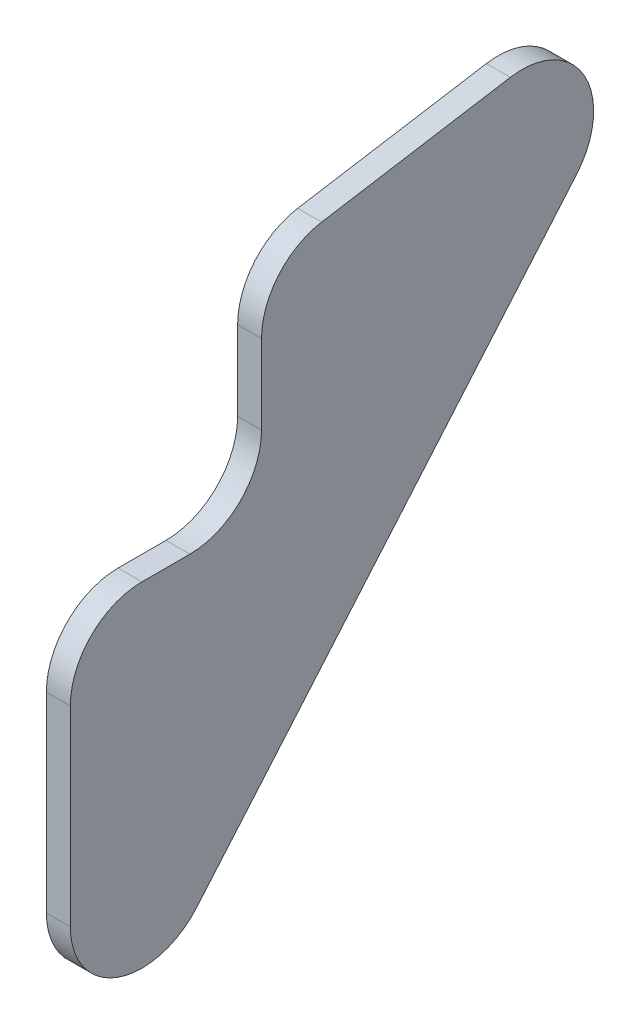
ISO-10303-21;
HEADER;
FILE_DESCRIPTION(('STEP AP214'),'2;1');
FILE_NAME('part.step','',(''),(''),'','','');
FILE_SCHEMA(('AUTOMOTIVE_DESIGN { 1 0 10303 214 1 1 1 1 }'));
ENDSEC;
DATA;
#1=APPLICATION_CONTEXT('core data for automotive mechanical design processes');
#2=APPLICATION_PROTOCOL_DEFINITION('international standard','automotive_design',2000,#1);
#3=PRODUCT_CONTEXT('',#1,'mechanical');
#4=PRODUCT('Part','Part','',(#3));
#5=PRODUCT_RELATED_PRODUCT_CATEGORY('part','',(#4));
#6=PRODUCT_DEFINITION_FORMATION('','',#4);
#7=PRODUCT_DEFINITION_CONTEXT('part definition',#1,'design');
#8=PRODUCT_DEFINITION('design','',#6,#7);
#9=PRODUCT_DEFINITION_SHAPE('','',#8);
#10=(LENGTH_UNIT() NAMED_UNIT(*) SI_UNIT(.MILLI.,.METRE.));
#11=(NAMED_UNIT(*) PLANE_ANGLE_UNIT() SI_UNIT($,.RADIAN.));
#12=(NAMED_UNIT(*) SI_UNIT($,.STERADIAN.) SOLID_ANGLE_UNIT());
#13=UNCERTAINTY_MEASURE_WITH_UNIT(LENGTH_MEASURE(1.E-05),#10,'distance_accuracy_value','');
#14=(GEOMETRIC_REPRESENTATION_CONTEXT(3) GLOBAL_UNCERTAINTY_ASSIGNED_CONTEXT((#13)) GLOBAL_UNIT_ASSIGNED_CONTEXT((#10,
#11,#12)) REPRESENTATION_CONTEXT('',''));
#15=CARTESIAN_POINT('',(0.,0.,0.));
#16=DIRECTION('',(0.,0.,1.));
#17=DIRECTION('',(1.,0.,0.));
#18=AXIS2_PLACEMENT_3D('',#15,#16,#17);
#19=CARTESIAN_POINT('',(66.4210624839999,259.204574554,1328.475334154));
#20=DIRECTION('',(1.,0.,0.));
#21=DIRECTION('',(0.,0.,-1.));
#22=AXIS2_PLACEMENT_3D('',#19,#20,#21);
#23=CYLINDRICAL_SURFACE('',#22,9.52499999999995);
#24=CARTESIAN_POINT('',(69.5960624839999,259.204574554,1328.475334154));
#25=DIRECTION('',(1.,0.,0.));
#26=DIRECTION('',(0.,0.,-1.));
#27=AXIS2_PLACEMENT_3D('',#24,#25,#26);
#28=CIRCLE('',#27,9.52499999999995);
#29=CARTESIAN_POINT('',(69.5960624839999,259.204574554,1338.000334154));
#30=VERTEX_POINT('',#29);
#31=CARTESIAN_POINT('',(69.5960624839999,253.019073049506,1321.23204787373));
#32=VERTEX_POINT('',#31);
#33=EDGE_CURVE('E161',#30,#32,#28,.T.);
#34=ORIENTED_EDGE('',*,*,#33,.F.);
#35=DIRECTION('',(1.,0.,0.));
#36=VECTOR('',#35,1.);
#37=CARTESIAN_POINT('',(66.4210624839999,259.204574554,1338.000334154));
#38=LINE('',#37,#36);
#39=CARTESIAN_POINT('',(66.4210624839999,259.204574554,1338.000334154));
#40=VERTEX_POINT('',#39);
#41=EDGE_CURVE('E138',#40,#30,#38,.T.);
#42=ORIENTED_EDGE('',*,*,#41,.F.);
#43=CARTESIAN_POINT('',(66.4210624839999,259.204574554,1328.475334154));
#44=DIRECTION('',(1.,0.,0.));
#45=DIRECTION('',(0.,0.,-1.));
#46=AXIS2_PLACEMENT_3D('',#43,#44,#45);
#47=CIRCLE('',#46,9.52499999999995);
#48=CARTESIAN_POINT('',(66.4210624839999,253.019073049506,1321.23204787373));
#49=VERTEX_POINT('',#48);
#50=EDGE_CURVE('E132',#40,#49,#47,.T.);
#51=ORIENTED_EDGE('',*,*,#50,.T.);
#52=DIRECTION('',(1.,0.,0.));
#53=VECTOR('',#52,1.);
#54=CARTESIAN_POINT('',(66.4210624839999,253.019073049506,1321.23204787373));
#55=LINE('',#54,#53);
#56=EDGE_CURVE('E114',#49,#32,#55,.T.);
#57=ORIENTED_EDGE('',*,*,#56,.T.);
#58=EDGE_LOOP('',(#34,#42,#51,#57));
#59=FACE_BOUND('',#58,.T.);
#60=ADVANCED_FACE('F39',(#59),#23,.T.);
#61=CARTESIAN_POINT('',(66.4210624839999,259.204574554,1338.000334154));
#62=DIRECTION('',(0.,0.,1.));
#63=DIRECTION('',(1.,0.,0.));
#64=AXIS2_PLACEMENT_3D('',#61,#62,#63);
#65=PLANE('',#64);
#66=DIRECTION('',(0.,-1.,0.));
#67=VECTOR('',#66,1.);
#68=CARTESIAN_POINT('',(69.5960624839999,259.204574554,1338.000334154));
#69=LINE('',#68,#67);
#70=CARTESIAN_POINT('',(69.5960624839999,284.604574554,1338.000334154));
#71=VERTEX_POINT('',#70);
#72=EDGE_CURVE('E139',#71,#30,#69,.T.);
#73=ORIENTED_EDGE('',*,*,#72,.F.);
#74=DIRECTION('',(1.,0.,0.));
#75=VECTOR('',#74,1.);
#76=CARTESIAN_POINT('',(66.4210624839999,284.604574554,1338.000334154));
#77=LINE('',#76,#75);
#78=CARTESIAN_POINT('',(66.4210624839999,284.604574554,1338.000334154));
#79=VERTEX_POINT('',#78);
#80=EDGE_CURVE('E181',#79,#71,#77,.T.);
#81=ORIENTED_EDGE('',*,*,#80,.F.);
#82=DIRECTION('',(0.,-1.,0.));
#83=VECTOR('',#82,1.);
#84=CARTESIAN_POINT('',(66.4210624839999,259.204574554,1338.000334154));
#85=LINE('',#84,#83);
#86=EDGE_CURVE('E125',#79,#40,#85,.T.);
#87=ORIENTED_EDGE('',*,*,#86,.T.);
#88=ORIENTED_EDGE('',*,*,#41,.T.);
#89=EDGE_LOOP('',(#73,#81,#87,#88));
#90=FACE_BOUND('',#89,.T.);
#91=ADVANCED_FACE('F215',(#90),#65,.T.);
#92=CARTESIAN_POINT('',(66.4210624839999,284.604574554,1328.475334154));
#93=DIRECTION('',(1.,0.,0.));
#94=DIRECTION('',(0.,0.,-1.));
#95=AXIS2_PLACEMENT_3D('',#92,#93,#94);
#96=CYLINDRICAL_SURFACE('',#95,9.52500000000001);
#97=CARTESIAN_POINT('',(69.5960624839999,284.604574554,1328.475334154));
#98=DIRECTION('',(1.,0.,0.));
#99=DIRECTION('',(0.,0.,-1.));
#100=AXIS2_PLACEMENT_3D('',#97,#98,#99);
#101=CIRCLE('',#100,9.52500000000001);
#102=CARTESIAN_POINT('',(69.5960624839999,294.129574554,1328.475334154));
#103=VERTEX_POINT('',#102);
#104=EDGE_CURVE('E142',#103,#71,#101,.T.);
#105=ORIENTED_EDGE('',*,*,#104,.F.);
#106=DIRECTION('',(1.,0.,0.));
#107=VECTOR('',#106,1.);
#108=CARTESIAN_POINT('',(66.4210624839999,294.129574554,1328.475334154));
#109=LINE('',#108,#107);
#110=CARTESIAN_POINT('',(66.4210624839999,294.129574554,1328.475334154));
#111=VERTEX_POINT('',#110);
#112=EDGE_CURVE('E183',#111,#103,#109,.T.);
#113=ORIENTED_EDGE('',*,*,#112,.F.);
#114=CARTESIAN_POINT('',(66.4210624839999,284.604574554,1328.475334154));
#115=DIRECTION('',(1.,0.,0.));
#116=DIRECTION('',(0.,0.,-1.));
#117=AXIS2_PLACEMENT_3D('',#114,#115,#116);
#118=CIRCLE('',#117,9.52500000000001);
#119=EDGE_CURVE('E157',#111,#79,#118,.T.);
#120=ORIENTED_EDGE('',*,*,#119,.T.);
#121=ORIENTED_EDGE('',*,*,#80,.T.);
#122=EDGE_LOOP('',(#105,#113,#120,#121));
#123=FACE_BOUND('',#122,.T.);
#124=ADVANCED_FACE('F219',(#123),#96,.T.);
#125=CARTESIAN_POINT('',(66.4210624839999,294.129574554,1312.600334154));
#126=DIRECTION('',(0.,1.,0.));
#127=DIRECTION('',(0.,0.,1.));
#128=AXIS2_PLACEMENT_3D('',#125,#126,#127);
#129=PLANE('',#128);
#130=DIRECTION('',(0.,0.,1.));
#131=VECTOR('',#130,1.);
#132=CARTESIAN_POINT('',(69.5960624839999,294.129574554,1312.600334154));
#133=LINE('',#132,#131);
#134=CARTESIAN_POINT('',(69.5960624839999,294.129574554,1322.125334154));
#135=VERTEX_POINT('',#134);
#136=EDGE_CURVE('E175',#135,#103,#133,.T.);
#137=ORIENTED_EDGE('',*,*,#136,.F.);
#138=DIRECTION('',(1.,0.,0.));
#139=VECTOR('',#138,1.);
#140=CARTESIAN_POINT('',(66.4210624839999,294.129574554,1322.125334154));
#141=LINE('',#140,#139);
#142=CARTESIAN_POINT('',(66.4210624839999,294.129574554,1322.125334154));
#143=VERTEX_POINT('',#142);
#144=EDGE_CURVE('E54',#135,#143,#141,.F.);
#145=ORIENTED_EDGE('',*,*,#144,.T.);
#146=DIRECTION('',(0.,0.,1.));
#147=VECTOR('',#146,1.);
#148=CARTESIAN_POINT('',(66.4210624839999,294.129574554,1312.600334154));
#149=LINE('',#148,#147);
#150=EDGE_CURVE('E155',#143,#111,#149,.T.);
#151=ORIENTED_EDGE('',*,*,#150,.T.);
#152=ORIENTED_EDGE('',*,*,#112,.T.);
#153=EDGE_LOOP('',(#137,#145,#151,#152));
#154=FACE_BOUND('',#153,.T.);
#155=ADVANCED_FACE('F237',(#154),#129,.T.);
#156=CARTESIAN_POINT('',(66.4210624839999,314.179001214867,1312.600334154));
#157=DIRECTION('',(0.,0.,1.));
#158=DIRECTION('',(1.,0.,0.));
#159=AXIS2_PLACEMENT_3D('',#156,#157,#158);
#160=PLANE('',#159);
#161=DIRECTION('',(0.,-1.,0.));
#162=VECTOR('',#161,1.);
#163=CARTESIAN_POINT('',(66.4210624839999,314.179001214867,1312.600334154));
#164=LINE('',#163,#162);
#165=CARTESIAN_POINT('',(66.4210624839999,314.179001214867,1312.600334154));
#166=VERTEX_POINT('',#165);
#167=CARTESIAN_POINT('',(66.4210624839999,303.654574554,1312.600334154));
#168=VERTEX_POINT('',#167);
#169=EDGE_CURVE('E152',#166,#168,#164,.T.);
#170=ORIENTED_EDGE('',*,*,#169,.T.);
#171=DIRECTION('',(1.,0.,0.));
#172=VECTOR('',#171,1.);
#173=CARTESIAN_POINT('',(69.5960624839999,303.654574554,1312.600334154));
#174=LINE('',#173,#172);
#175=CARTESIAN_POINT('',(69.5960624839999,303.654574554,1312.600334154));
#176=VERTEX_POINT('',#175);
#177=EDGE_CURVE('E180',#168,#176,#174,.T.);
#178=ORIENTED_EDGE('',*,*,#177,.T.);
#179=DIRECTION('',(0.,-1.,0.));
#180=VECTOR('',#179,1.);
#181=CARTESIAN_POINT('',(69.5960624839999,314.179001214867,1312.600334154));
#182=LINE('',#181,#180);
#183=CARTESIAN_POINT('',(69.5960624839999,314.179001214867,1312.600334154));
#184=VERTEX_POINT('',#183);
#185=EDGE_CURVE('E173',#184,#176,#182,.T.);
#186=ORIENTED_EDGE('',*,*,#185,.F.);
#187=DIRECTION('',(1.,0.,0.));
#188=VECTOR('',#187,1.);
#189=CARTESIAN_POINT('',(66.4210624839999,314.179001214867,1312.600334154));
#190=LINE('',#189,#188);
#191=EDGE_CURVE('E186',#166,#184,#190,.T.);
#192=ORIENTED_EDGE('',*,*,#191,.F.);
#193=EDGE_LOOP('',(#170,#178,#186,#192));
#194=FACE_BOUND('',#193,.T.);
#195=ADVANCED_FACE('F198',(#194),#160,.T.);
#196=CARTESIAN_POINT('',(66.4210624839999,314.179001214867,1303.075334154));
#197=DIRECTION('',(1.,0.,0.));
#198=DIRECTION('',(0.,0.,-1.));
#199=AXIS2_PLACEMENT_3D('',#196,#197,#198);
#200=CYLINDRICAL_SURFACE('',#199,9.52500000000004);
#201=CARTESIAN_POINT('',(69.5960624839999,314.179001214867,1303.075334154));
#202=DIRECTION('',(1.,0.,0.));
#203=DIRECTION('',(0.,0.,-1.));
#204=AXIS2_PLACEMENT_3D('',#201,#202,#203);
#205=CIRCLE('',#204,9.52500000000004);
#206=CARTESIAN_POINT('',(69.5960624839999,323.577914145841,1304.62002205645));
#207=VERTEX_POINT('',#206);
#208=EDGE_CURVE('E170',#207,#184,#205,.T.);
#209=ORIENTED_EDGE('',*,*,#208,.F.);
#210=DIRECTION('',(1.,0.,0.));
#211=VECTOR('',#210,1.);
#212=CARTESIAN_POINT('',(66.4210624839999,323.577914145841,1304.62002205645));
#213=LINE('',#212,#211);
#214=CARTESIAN_POINT('',(66.4210624839999,323.577914145841,1304.62002205645));
#215=VERTEX_POINT('',#214);
#216=EDGE_CURVE('E188',#215,#207,#213,.T.);
#217=ORIENTED_EDGE('',*,*,#216,.F.);
#218=CARTESIAN_POINT('',(66.4210624839999,314.179001214867,1303.075334154));
#219=DIRECTION('',(1.,0.,0.));
#220=DIRECTION('',(0.,0.,-1.));
#221=AXIS2_PLACEMENT_3D('',#218,#219,#220);
#222=CIRCLE('',#221,9.52500000000004);
#223=EDGE_CURVE('E149',#215,#166,#222,.T.);
#224=ORIENTED_EDGE('',*,*,#223,.T.);
#225=ORIENTED_EDGE('',*,*,#191,.T.);
#226=EDGE_LOOP('',(#209,#217,#224,#225));
#227=FACE_BOUND('',#226,.T.);
#228=ADVANCED_FACE('F206',(#227),#200,.T.);
#229=CARTESIAN_POINT('',(66.4210624839999,323.577914145841,1304.62002205645));
#230=DIRECTION('',(0.,0.986762512438189,0.162171958262434));
#231=DIRECTION('',(0.,-0.162171958262434,0.986762512438189));
#232=AXIS2_PLACEMENT_3D('',#229,#230,#231);
#233=PLANE('',#232);
#234=DIRECTION('',(0.,-0.162171958262434,0.986762512438189));
#235=VECTOR('',#234,1.);
#236=CARTESIAN_POINT('',(69.5960624839999,323.577914145841,1304.62002205645));
#237=LINE('',#236,#235);
#238=CARTESIAN_POINT('',(69.5960624839999,327.697081885707,1279.55625424052));
#239=VERTEX_POINT('',#238);
#240=EDGE_CURVE('E167',#239,#207,#237,.T.);
#241=ORIENTED_EDGE('',*,*,#240,.F.);
#242=DIRECTION('',(1.,0.,0.));
#243=VECTOR('',#242,1.);
#244=CARTESIAN_POINT('',(66.4210624839999,327.697081885707,1279.55625424052));
#245=LINE('',#244,#243);
#246=CARTESIAN_POINT('',(66.4210624839999,327.697081885707,1279.55625424052));
#247=VERTEX_POINT('',#246);
#248=EDGE_CURVE('E190',#247,#239,#245,.T.);
#249=ORIENTED_EDGE('',*,*,#248,.F.);
#250=DIRECTION('',(0.,-0.162171958262434,0.986762512438189));
#251=VECTOR('',#250,1.);
#252=CARTESIAN_POINT('',(66.4210624839999,323.577914145841,1304.62002205645));
#253=LINE('',#252,#251);
#254=EDGE_CURVE('E146',#247,#215,#253,.T.);
#255=ORIENTED_EDGE('',*,*,#254,.T.);
#256=ORIENTED_EDGE('',*,*,#216,.T.);
#257=EDGE_LOOP('',(#241,#249,#255,#256));
#258=FACE_BOUND('',#257,.T.);
#259=ADVANCED_FACE('F228',(#258),#233,.T.);
#260=CARTESIAN_POINT('',(66.4210624839999,318.298168954733,1278.01156633807));
#261=DIRECTION('',(1.,0.,0.));
#262=DIRECTION('',(0.,0.,-1.));
#263=AXIS2_PLACEMENT_3D('',#260,#261,#262);
#264=CYLINDRICAL_SURFACE('',#263,9.52500000000001);
#265=CARTESIAN_POINT('',(69.5960624839999,318.298168954733,1278.01156633807));
#266=DIRECTION('',(1.,0.,0.));
#267=DIRECTION('',(0.,0.,-1.));
#268=AXIS2_PLACEMENT_3D('',#265,#266,#267);
#269=CIRCLE('',#268,9.52500000000001);
#270=CARTESIAN_POINT('',(69.5960624839999,312.112667450239,1270.7682800578));
#271=VERTEX_POINT('',#270);
#272=EDGE_CURVE('E164',#271,#239,#269,.T.);
#273=ORIENTED_EDGE('',*,*,#272,.F.);
#274=DIRECTION('',(1.,0.,0.));
#275=VECTOR('',#274,1.);
#276=CARTESIAN_POINT('',(66.4210624839999,312.112667450239,1270.7682800578));
#277=LINE('',#276,#275);
#278=CARTESIAN_POINT('',(66.4210624839999,312.112667450239,1270.7682800578));
#279=VERTEX_POINT('',#278);
#280=EDGE_CURVE('E124',#279,#271,#277,.T.);
#281=ORIENTED_EDGE('',*,*,#280,.F.);
#282=CARTESIAN_POINT('',(66.4210624839999,318.298168954733,1278.01156633807));
#283=DIRECTION('',(1.,0.,0.));
#284=DIRECTION('',(0.,0.,-1.));
#285=AXIS2_PLACEMENT_3D('',#282,#283,#284);
#286=CIRCLE('',#285,9.52500000000001);
#287=EDGE_CURVE('E136',#279,#247,#286,.T.);
#288=ORIENTED_EDGE('',*,*,#287,.T.);
#289=ORIENTED_EDGE('',*,*,#248,.T.);
#290=EDGE_LOOP('',(#273,#281,#288,#289));
#291=FACE_BOUND('',#290,.T.);
#292=ADVANCED_FACE('F225',(#291),#264,.T.);
#293=CARTESIAN_POINT('',(66.4210624839999,253.019073049506,1321.23204787373));
#294=DIRECTION('',(0.,-0.649396483411453,-0.760450003177618));
#295=DIRECTION('',(0.,0.760450003177618,-0.649396483411453));
#296=AXIS2_PLACEMENT_3D('',#293,#294,#295);
#297=PLANE('',#296);
#298=DIRECTION('',(0.,0.760450003177618,-0.649396483411453));
#299=VECTOR('',#298,1.);
#300=CARTESIAN_POINT('',(69.5960624839999,253.019073049506,1321.23204787373));
#301=LINE('',#300,#299);
#302=EDGE_CURVE('E119',#32,#271,#301,.T.);
#303=ORIENTED_EDGE('',*,*,#302,.F.);
#304=ORIENTED_EDGE('',*,*,#56,.F.);
#305=DIRECTION('',(0.,0.760450003177618,-0.649396483411453));
#306=VECTOR('',#305,1.);
#307=CARTESIAN_POINT('',(66.4210624839999,253.019073049506,1321.23204787373));
#308=LINE('',#307,#306);
#309=EDGE_CURVE('E117',#49,#279,#308,.T.);
#310=ORIENTED_EDGE('',*,*,#309,.T.);
#311=ORIENTED_EDGE('',*,*,#280,.T.);
#312=EDGE_LOOP('',(#303,#304,#310,#311));
#313=FACE_BOUND('',#312,.T.);
#314=ADVANCED_FACE('F116',(#313),#297,.T.);
#315=CARTESIAN_POINT('',(66.4210624839999,259.204574554,1328.475334154));
#316=DIRECTION('',(1.,0.,0.));
#317=DIRECTION('',(0.,0.,-1.));
#318=AXIS2_PLACEMENT_3D('',#315,#316,#317);
#319=PLANE('',#318);
#320=ORIENTED_EDGE('',*,*,#50,.F.);
#321=ORIENTED_EDGE('',*,*,#86,.F.);
#322=ORIENTED_EDGE('',*,*,#119,.F.);
#323=ORIENTED_EDGE('',*,*,#150,.F.);
#324=CARTESIAN_POINT('',(66.4210624839999,303.654574554,1322.125334154));
#325=DIRECTION('',(1.,0.,0.));
#326=DIRECTION('',(0.,0.,-1.));
#327=AXIS2_PLACEMENT_3D('',#324,#325,#326);
#328=CIRCLE('',#327,9.525);
#329=EDGE_CURVE('E11',#143,#168,#328,.T.);
#330=ORIENTED_EDGE('',*,*,#329,.T.);
#331=ORIENTED_EDGE('',*,*,#169,.F.);
#332=ORIENTED_EDGE('',*,*,#223,.F.);
#333=ORIENTED_EDGE('',*,*,#254,.F.);
#334=ORIENTED_EDGE('',*,*,#287,.F.);
#335=ORIENTED_EDGE('',*,*,#309,.F.);
#336=EDGE_LOOP('',(#320,#321,#322,#323,#330,#331,#332,#333,#334,#335));
#337=FACE_BOUND('',#336,.T.);
#338=ADVANCED_FACE('F130',(#337),#319,.F.);
#339=CARTESIAN_POINT('',(69.5960624839999,259.204574554,1328.475334154));
#340=DIRECTION('',(1.,0.,0.));
#341=DIRECTION('',(0.,0.,-1.));
#342=AXIS2_PLACEMENT_3D('',#339,#340,#341);
#343=PLANE('',#342);
#344=ORIENTED_EDGE('',*,*,#33,.T.);
#345=ORIENTED_EDGE('',*,*,#302,.T.);
#346=ORIENTED_EDGE('',*,*,#272,.T.);
#347=ORIENTED_EDGE('',*,*,#240,.T.);
#348=ORIENTED_EDGE('',*,*,#208,.T.);
#349=ORIENTED_EDGE('',*,*,#185,.T.);
#350=CARTESIAN_POINT('',(69.5960624839999,303.654574554,1322.125334154));
#351=DIRECTION('',(1.,0.,0.));
#352=DIRECTION('',(0.,0.,-1.));
#353=AXIS2_PLACEMENT_3D('',#350,#351,#352);
#354=CIRCLE('',#353,9.525);
#355=EDGE_CURVE('E47',#176,#135,#354,.F.);
#356=ORIENTED_EDGE('',*,*,#355,.T.);
#357=ORIENTED_EDGE('',*,*,#136,.T.);
#358=ORIENTED_EDGE('',*,*,#104,.T.);
#359=ORIENTED_EDGE('',*,*,#72,.T.);
#360=EDGE_LOOP('',(#344,#345,#346,#347,#348,#349,#356,#357,#358,#359));
#361=FACE_BOUND('',#360,.T.);
#362=ADVANCED_FACE('F202',(#361),#343,.T.);
#363=CARTESIAN_POINT('',(66.4210624839999,303.654574554,1322.125334154));
#364=DIRECTION('',(-1.,0.,0.));
#365=DIRECTION('',(0.,0.,1.));
#366=AXIS2_PLACEMENT_3D('',#363,#364,#365);
#367=CYLINDRICAL_SURFACE('',#366,9.525);
#368=ORIENTED_EDGE('',*,*,#329,.F.);
#369=ORIENTED_EDGE('',*,*,#144,.F.);
#370=ORIENTED_EDGE('',*,*,#355,.F.);
#371=ORIENTED_EDGE('',*,*,#177,.F.);
#372=EDGE_LOOP('',(#368,#369,#370,#371));
#373=FACE_BOUND('',#372,.T.);
#374=ADVANCED_FACE('F41',(#373),#367,.F.);
#375=CLOSED_SHELL('',(#60,#91,#124,#155,#195,#228,#259,#292,#314,#338,#362,#374));
#376=MANIFOLD_SOLID_BREP('B2',#375);
#377=ADVANCED_BREP_SHAPE_REPRESENTATION('',(#18,#376),#14);
#378=SHAPE_DEFINITION_REPRESENTATION(#9,#377);
ENDSEC;
END-ISO-10303-21;
